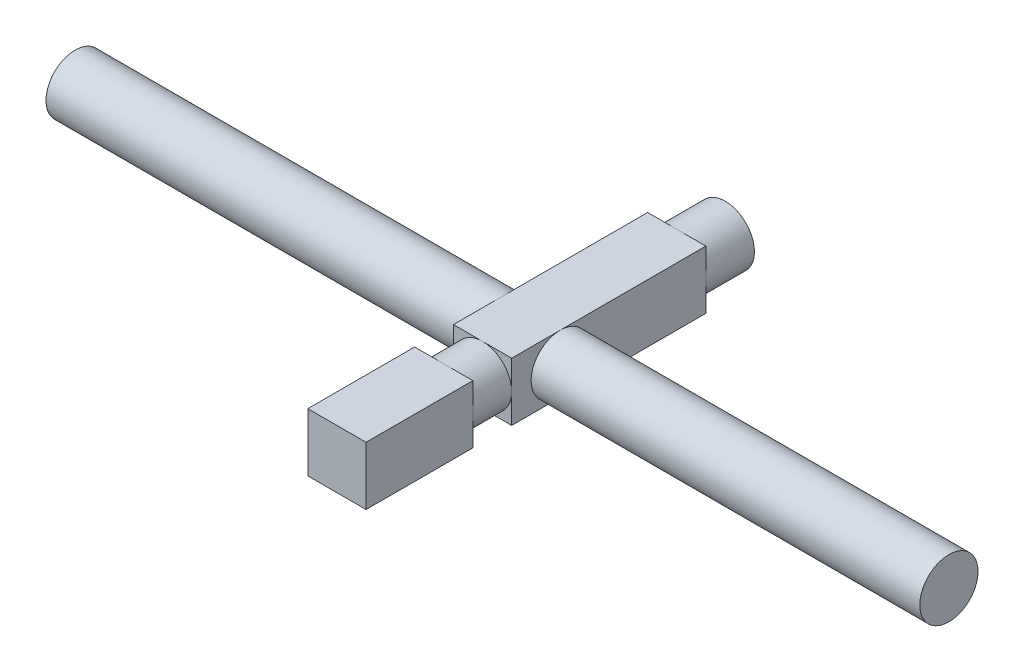
ISO-10303-21;
HEADER;
FILE_DESCRIPTION(('STEP AP214'),'2;1');
FILE_NAME('part.step','',(''),(''),'','','');
FILE_SCHEMA(('AUTOMOTIVE_DESIGN { 1 0 10303 214 1 1 1 1 }'));
ENDSEC;
DATA;
#1=APPLICATION_CONTEXT('core data for automotive mechanical design processes');
#2=APPLICATION_PROTOCOL_DEFINITION('international standard','automotive_design',2000,#1);
#3=PRODUCT_CONTEXT('',#1,'mechanical');
#4=PRODUCT('Part','Part','',(#3));
#5=PRODUCT_RELATED_PRODUCT_CATEGORY('part','',(#4));
#6=PRODUCT_DEFINITION_FORMATION('','',#4);
#7=PRODUCT_DEFINITION_CONTEXT('part definition',#1,'design');
#8=PRODUCT_DEFINITION('design','',#6,#7);
#9=PRODUCT_DEFINITION_SHAPE('','',#8);
#10=(LENGTH_UNIT() NAMED_UNIT(*) SI_UNIT(.MILLI.,.METRE.));
#11=(NAMED_UNIT(*) PLANE_ANGLE_UNIT() SI_UNIT($,.RADIAN.));
#12=(NAMED_UNIT(*) SI_UNIT($,.STERADIAN.) SOLID_ANGLE_UNIT());
#13=UNCERTAINTY_MEASURE_WITH_UNIT(LENGTH_MEASURE(1.E-05),#10,'distance_accuracy_value','');
#14=(GEOMETRIC_REPRESENTATION_CONTEXT(3) GLOBAL_UNCERTAINTY_ASSIGNED_CONTEXT((#13)) GLOBAL_UNIT_ASSIGNED_CONTEXT((#10,
#11,#12)) REPRESENTATION_CONTEXT('',''));
#15=CARTESIAN_POINT('',(0.,0.,0.));
#16=DIRECTION('',(0.,0.,1.));
#17=DIRECTION('',(1.,0.,0.));
#18=AXIS2_PLACEMENT_3D('',#15,#16,#17);
#19=CARTESIAN_POINT('',(-3.,-3.00000000000001,-20.));
#20=DIRECTION('',(0.,-1.,0.));
#21=DIRECTION('',(0.,0.,-1.));
#22=AXIS2_PLACEMENT_3D('',#19,#20,#21);
#23=PLANE('',#22);
#24=DIRECTION('',(0.,0.,-1.));
#25=VECTOR('',#24,1.);
#26=CARTESIAN_POINT('',(3.,-3.00000000000001,-20.));
#27=LINE('',#26,#25);
#28=CARTESIAN_POINT('',(3.,-3.,5.));
#29=VERTEX_POINT('',#28);
#30=CARTESIAN_POINT('',(3.,-3.,0.));
#31=VERTEX_POINT('',#30);
#32=EDGE_CURVE('E284',#29,#31,#27,.T.);
#33=ORIENTED_EDGE('',*,*,#32,.F.);
#34=DIRECTION('',(-1.,0.,0.));
#35=VECTOR('',#34,1.);
#36=CARTESIAN_POINT('',(-3.,-3.,5.));
#37=LINE('',#36,#35);
#38=CARTESIAN_POINT('',(0.,-3.,5.));
#39=VERTEX_POINT('',#38);
#40=EDGE_CURVE('E122',#29,#39,#37,.T.);
#41=ORIENTED_EDGE('',*,*,#40,.T.);
#42=CARTESIAN_POINT('',(-3.,-3.,5.));
#43=VERTEX_POINT('',#42);
#44=EDGE_CURVE('E332',#39,#43,#37,.T.);
#45=ORIENTED_EDGE('',*,*,#44,.T.);
#46=DIRECTION('',(0.,0.,-1.));
#47=VECTOR('',#46,1.);
#48=CARTESIAN_POINT('',(-3.,-3.00000000000001,-20.));
#49=LINE('',#48,#47);
#50=CARTESIAN_POINT('',(-3.,-3.,0.));
#51=VERTEX_POINT('',#50);
#52=EDGE_CURVE('E273',#43,#51,#49,.T.);
#53=ORIENTED_EDGE('',*,*,#52,.T.);
#54=CARTESIAN_POINT('',(-3.,-3.00000000000001,-15.));
#55=VERTEX_POINT('',#54);
#56=EDGE_CURVE('E274',#51,#55,#49,.T.);
#57=ORIENTED_EDGE('',*,*,#56,.T.);
#58=DIRECTION('',(-1.,0.,0.));
#59=VECTOR('',#58,1.);
#60=CARTESIAN_POINT('',(0.,-3.00000000000001,-15.));
#61=LINE('',#60,#59);
#62=CARTESIAN_POINT('',(0.,-3.00000000000001,-15.));
#63=VERTEX_POINT('',#62);
#64=EDGE_CURVE('E316',#63,#55,#61,.T.);
#65=ORIENTED_EDGE('',*,*,#64,.F.);
#66=DIRECTION('',(-1.,0.,0.));
#67=VECTOR('',#66,1.);
#68=CARTESIAN_POINT('',(0.,-3.00000000000001,-15.));
#69=LINE('',#68,#67);
#70=CARTESIAN_POINT('',(3.,-3.00000000000001,-15.));
#71=VERTEX_POINT('',#70);
#72=EDGE_CURVE('E309',#71,#63,#69,.T.);
#73=ORIENTED_EDGE('',*,*,#72,.F.);
#74=EDGE_CURVE('E285',#31,#71,#27,.T.);
#75=ORIENTED_EDGE('',*,*,#74,.F.);
#76=EDGE_LOOP('',(#33,#41,#45,#53,#57,#65,#73,#75));
#77=FACE_BOUND('',#76,.T.);
#78=ADVANCED_FACE('F99',(#77),#23,.T.);
#79=CARTESIAN_POINT('',(-3.,3.00000000000001,-20.));
#80=DIRECTION('',(0.,1.,0.));
#81=DIRECTION('',(0.,0.,1.));
#82=AXIS2_PLACEMENT_3D('',#79,#80,#81);
#83=PLANE('',#82);
#84=DIRECTION('',(0.,0.,1.));
#85=VECTOR('',#84,1.);
#86=CARTESIAN_POINT('',(-3.,3.00000000000001,-20.));
#87=LINE('',#86,#85);
#88=CARTESIAN_POINT('',(-3.,3.,0.));
#89=VERTEX_POINT('',#88);
#90=CARTESIAN_POINT('',(-3.,3.,5.));
#91=VERTEX_POINT('',#90);
#92=EDGE_CURVE('E268',#89,#91,#87,.T.);
#93=ORIENTED_EDGE('',*,*,#92,.T.);
#94=DIRECTION('',(1.,0.,0.));
#95=VECTOR('',#94,1.);
#96=CARTESIAN_POINT('',(-3.,3.,5.));
#97=LINE('',#96,#95);
#98=CARTESIAN_POINT('',(0.,3.,5.));
#99=VERTEX_POINT('',#98);
#100=EDGE_CURVE('E334',#91,#99,#97,.T.);
#101=ORIENTED_EDGE('',*,*,#100,.T.);
#102=CARTESIAN_POINT('',(3.,3.00000000000001,5.));
#103=VERTEX_POINT('',#102);
#104=EDGE_CURVE('E235',#99,#103,#97,.T.);
#105=ORIENTED_EDGE('',*,*,#104,.T.);
#106=DIRECTION('',(0.,0.,1.));
#107=VECTOR('',#106,1.);
#108=CARTESIAN_POINT('',(3.,3.00000000000001,-20.));
#109=LINE('',#108,#107);
#110=CARTESIAN_POINT('',(3.,3.,0.));
#111=VERTEX_POINT('',#110);
#112=EDGE_CURVE('E243',#111,#103,#109,.T.);
#113=ORIENTED_EDGE('',*,*,#112,.F.);
#114=CARTESIAN_POINT('',(3.,3.,-15.));
#115=VERTEX_POINT('',#114);
#116=EDGE_CURVE('E278',#115,#111,#109,.T.);
#117=ORIENTED_EDGE('',*,*,#116,.F.);
#118=DIRECTION('',(1.,0.,0.));
#119=VECTOR('',#118,1.);
#120=CARTESIAN_POINT('',(0.,3.00000000000001,-15.));
#121=LINE('',#120,#119);
#122=CARTESIAN_POINT('',(0.,3.00000000000001,-15.));
#123=VERTEX_POINT('',#122);
#124=EDGE_CURVE('E294',#123,#115,#121,.T.);
#125=ORIENTED_EDGE('',*,*,#124,.F.);
#126=DIRECTION('',(1.,0.,0.));
#127=VECTOR('',#126,1.);
#128=CARTESIAN_POINT('',(0.,3.00000000000001,-15.));
#129=LINE('',#128,#127);
#130=CARTESIAN_POINT('',(-3.,3.00000000000001,-15.));
#131=VERTEX_POINT('',#130);
#132=EDGE_CURVE('E302',#131,#123,#129,.T.);
#133=ORIENTED_EDGE('',*,*,#132,.F.);
#134=EDGE_CURVE('E266',#131,#89,#87,.T.);
#135=ORIENTED_EDGE('',*,*,#134,.T.);
#136=EDGE_LOOP('',(#93,#101,#105,#113,#117,#125,#133,#135));
#137=FACE_BOUND('',#136,.T.);
#138=ADVANCED_FACE('F382',(#137),#83,.T.);
#139=CARTESIAN_POINT('',(-3.,0.,0.));
#140=DIRECTION('',(1.,0.,0.));
#141=DIRECTION('',(0.,0.,-1.));
#142=AXIS2_PLACEMENT_3D('',#139,#140,#141);
#143=PLANE('',#142);
#144=DIRECTION('',(0.,-1.,0.));
#145=VECTOR('',#144,1.);
#146=CARTESIAN_POINT('',(-3.,0.,5.));
#147=LINE('',#146,#145);
#148=CARTESIAN_POINT('',(-3.,0.,5.));
#149=VERTEX_POINT('',#148);
#150=EDGE_CURVE('E330',#91,#149,#147,.T.);
#151=ORIENTED_EDGE('',*,*,#150,.F.);
#152=ORIENTED_EDGE('',*,*,#92,.F.);
#153=CARTESIAN_POINT('',(-3.,0.,0.));
#154=DIRECTION('',(1.,0.,0.));
#155=DIRECTION('',(0.,0.,-1.));
#156=AXIS2_PLACEMENT_3D('',#153,#154,#155);
#157=CIRCLE('',#156,3.00000000000001);
#158=EDGE_CURVE('E221',#89,#51,#157,.T.);
#159=ORIENTED_EDGE('',*,*,#158,.T.);
#160=ORIENTED_EDGE('',*,*,#52,.F.);
#161=EDGE_CURVE('E329',#149,#43,#147,.T.);
#162=ORIENTED_EDGE('',*,*,#161,.F.);
#163=EDGE_LOOP('',(#151,#152,#159,#160,#162));
#164=FACE_BOUND('',#163,.T.);
#165=ADVANCED_FACE('F388',(#164),#143,.F.);
#166=CARTESIAN_POINT('',(3.,0.,0.));
#167=DIRECTION('',(1.,0.,0.));
#168=DIRECTION('',(0.,0.,-1.));
#169=AXIS2_PLACEMENT_3D('',#166,#167,#168);
#170=PLANE('',#169);
#171=ORIENTED_EDGE('',*,*,#112,.T.);
#172=DIRECTION('',(0.,-1.,0.));
#173=VECTOR('',#172,1.);
#174=CARTESIAN_POINT('',(3.,0.,5.));
#175=LINE('',#174,#173);
#176=CARTESIAN_POINT('',(3.,0.,5.));
#177=VERTEX_POINT('',#176);
#178=EDGE_CURVE('E220',#103,#177,#175,.T.);
#179=ORIENTED_EDGE('',*,*,#178,.T.);
#180=EDGE_CURVE('E212',#177,#29,#175,.T.);
#181=ORIENTED_EDGE('',*,*,#180,.T.);
#182=ORIENTED_EDGE('',*,*,#32,.T.);
#183=CARTESIAN_POINT('',(3.,0.,0.));
#184=DIRECTION('',(1.,0.,0.));
#185=DIRECTION('',(0.,0.,-1.));
#186=AXIS2_PLACEMENT_3D('',#183,#184,#185);
#187=CIRCLE('',#186,3.00000000000001);
#188=EDGE_CURVE('E248',#111,#31,#187,.T.);
#189=ORIENTED_EDGE('',*,*,#188,.F.);
#190=EDGE_LOOP('',(#171,#179,#181,#182,#189));
#191=FACE_BOUND('',#190,.T.);
#192=ADVANCED_FACE('F240',(#191),#170,.T.);
#193=CARTESIAN_POINT('',(-3.,-3.00000000000001,-20.));
#194=DIRECTION('',(0.,0.,-1.));
#195=DIRECTION('',(-1.,0.,0.));
#196=AXIS2_PLACEMENT_3D('',#193,#194,#195);
#197=PLANE('',#196);
#198=CARTESIAN_POINT('',(0.,0.,-20.));
#199=DIRECTION('',(0.,0.,-1.));
#200=DIRECTION('',(-1.,0.,0.));
#201=AXIS2_PLACEMENT_3D('',#198,#199,#200);
#202=CIRCLE('',#201,3.00000000000001);
#203=CARTESIAN_POINT('',(-3.00000000000001,0.,-20.));
#204=VERTEX_POINT('',#203);
#205=EDGE_CURVE('E286',#204,#204,#202,.T.);
#206=ORIENTED_EDGE('',*,*,#205,.T.);
#207=EDGE_LOOP('',(#206));
#208=FACE_BOUND('',#207,.T.);
#209=ADVANCED_FACE('F404',(#208),#197,.T.);
#210=DIRECTION('',(0.,1.,0.));
#211=VECTOR('',#210,1.);
#212=CARTESIAN_POINT('',(-3.,0.,-15.));
#213=LINE('',#212,#211);
#214=CARTESIAN_POINT('',(-3.,0.,-15.));
#215=VERTEX_POINT('',#214);
#216=EDGE_CURVE('E313',#55,#215,#213,.T.);
#217=ORIENTED_EDGE('',*,*,#216,.F.);
#218=ORIENTED_EDGE('',*,*,#56,.F.);
#219=EDGE_CURVE('E245',#51,#89,#157,.T.);
#220=ORIENTED_EDGE('',*,*,#219,.T.);
#221=ORIENTED_EDGE('',*,*,#134,.F.);
#222=DIRECTION('',(0.,1.,0.));
#223=VECTOR('',#222,1.);
#224=CARTESIAN_POINT('',(-3.,0.,-15.));
#225=LINE('',#224,#223);
#226=EDGE_CURVE('E300',#215,#131,#225,.T.);
#227=ORIENTED_EDGE('',*,*,#226,.F.);
#228=EDGE_LOOP('',(#217,#218,#220,#221,#227));
#229=FACE_BOUND('',#228,.T.);
#230=ADVANCED_FACE('F401',(#229),#143,.F.);
#231=ORIENTED_EDGE('',*,*,#74,.T.);
#232=DIRECTION('',(0.,-1.,0.));
#233=VECTOR('',#232,1.);
#234=CARTESIAN_POINT('',(3.,0.,-15.));
#235=LINE('',#234,#233);
#236=CARTESIAN_POINT('',(3.,0.,-15.));
#237=VERTEX_POINT('',#236);
#238=EDGE_CURVE('E307',#237,#71,#235,.T.);
#239=ORIENTED_EDGE('',*,*,#238,.F.);
#240=DIRECTION('',(0.,-1.,0.));
#241=VECTOR('',#240,1.);
#242=CARTESIAN_POINT('',(3.,0.,-15.));
#243=LINE('',#242,#241);
#244=EDGE_CURVE('E291',#115,#237,#243,.T.);
#245=ORIENTED_EDGE('',*,*,#244,.F.);
#246=ORIENTED_EDGE('',*,*,#116,.T.);
#247=EDGE_CURVE('E249',#31,#111,#187,.T.);
#248=ORIENTED_EDGE('',*,*,#247,.F.);
#249=EDGE_LOOP('',(#231,#239,#245,#246,#248));
#250=FACE_BOUND('',#249,.T.);
#251=ADVANCED_FACE('F411',(#250),#170,.T.);
#252=CARTESIAN_POINT('',(-46.9660194174757,0.,0.));
#253=DIRECTION('',(-1.,0.,0.));
#254=DIRECTION('',(0.,0.,1.));
#255=AXIS2_PLACEMENT_3D('',#252,#253,#254);
#256=CYLINDRICAL_SURFACE('',#255,3.00000000000001);
#257=CARTESIAN_POINT('',(-46.9660194174757,0.,0.));
#258=DIRECTION('',(-1.,0.,0.));
#259=DIRECTION('',(0.,0.,1.));
#260=AXIS2_PLACEMENT_3D('',#257,#258,#259);
#261=CIRCLE('',#260,3.);
#262=CARTESIAN_POINT('',(-46.9660194174757,0.,3.));
#263=VERTEX_POINT('',#262);
#264=EDGE_CURVE('E255',#263,#263,#261,.T.);
#265=ORIENTED_EDGE('',*,*,#264,.F.);
#266=EDGE_LOOP('',(#265));
#267=FACE_BOUND('',#266,.T.);
#268=ORIENTED_EDGE('',*,*,#158,.F.);
#269=ORIENTED_EDGE('',*,*,#219,.F.);
#270=EDGE_LOOP('',(#268,#269));
#271=FACE_BOUND('',#270,.T.);
#272=ADVANCED_FACE('F442',(#267,#271),#256,.T.);
#273=CARTESIAN_POINT('',(-46.9660194174757,3.,0.));
#274=DIRECTION('',(1.,0.,0.));
#275=DIRECTION('',(0.,0.,-1.));
#276=AXIS2_PLACEMENT_3D('',#273,#274,#275);
#277=PLANE('',#276);
#278=ORIENTED_EDGE('',*,*,#264,.T.);
#279=EDGE_LOOP('',(#278));
#280=FACE_BOUND('',#279,.T.);
#281=ADVANCED_FACE('F101',(#280),#277,.F.);
#282=CARTESIAN_POINT('',(43.0339805825243,0.,0.));
#283=DIRECTION('',(-1.,0.,0.));
#284=DIRECTION('',(0.,0.,1.));
#285=AXIS2_PLACEMENT_3D('',#282,#283,#284);
#286=PLANE('',#285);
#287=CARTESIAN_POINT('',(43.0339805825243,0.,0.));
#288=DIRECTION('',(-1.,0.,0.));
#289=DIRECTION('',(0.,0.,1.));
#290=AXIS2_PLACEMENT_3D('',#287,#288,#289);
#291=CIRCLE('',#290,3.00000000000001);
#292=CARTESIAN_POINT('',(43.0339805825243,0.,3.00000000000001));
#293=VERTEX_POINT('',#292);
#294=EDGE_CURVE('E252',#293,#293,#291,.T.);
#295=ORIENTED_EDGE('',*,*,#294,.F.);
#296=EDGE_LOOP('',(#295));
#297=FACE_BOUND('',#296,.T.);
#298=ADVANCED_FACE('F601',(#297),#286,.F.);
#299=ORIENTED_EDGE('',*,*,#247,.T.);
#300=ORIENTED_EDGE('',*,*,#188,.T.);
#301=EDGE_LOOP('',(#299,#300));
#302=FACE_BOUND('',#301,.T.);
#303=ORIENTED_EDGE('',*,*,#294,.T.);
#304=EDGE_LOOP('',(#303));
#305=FACE_BOUND('',#304,.T.);
#306=ADVANCED_FACE('F420',(#302,#305),#256,.T.);
#307=CARTESIAN_POINT('',(0.,0.,-15.));
#308=DIRECTION('',(0.,0.,-1.));
#309=DIRECTION('',(-1.,0.,0.));
#310=AXIS2_PLACEMENT_3D('',#307,#308,#309);
#311=CYLINDRICAL_SURFACE('',#310,3.00000000000001);
#312=ORIENTED_EDGE('',*,*,#205,.F.);
#313=EDGE_LOOP('',(#312));
#314=FACE_BOUND('',#313,.T.);
#315=CARTESIAN_POINT('',(0.,0.,-15.));
#316=DIRECTION('',(0.,0.,-1.));
#317=DIRECTION('',(-1.,0.,0.));
#318=AXIS2_PLACEMENT_3D('',#315,#316,#317);
#319=CIRCLE('',#318,3.00000000000001);
#320=EDGE_CURVE('E312',#63,#215,#319,.T.);
#321=ORIENTED_EDGE('',*,*,#320,.T.);
#322=CARTESIAN_POINT('',(0.,0.,-15.));
#323=DIRECTION('',(0.,0.,-1.));
#324=DIRECTION('',(-1.,0.,0.));
#325=AXIS2_PLACEMENT_3D('',#322,#323,#324);
#326=CIRCLE('',#325,3.00000000000001);
#327=EDGE_CURVE('E290',#215,#123,#326,.T.);
#328=ORIENTED_EDGE('',*,*,#327,.T.);
#329=CARTESIAN_POINT('',(0.,0.,-15.));
#330=DIRECTION('',(0.,0.,-1.));
#331=DIRECTION('',(-1.,0.,0.));
#332=AXIS2_PLACEMENT_3D('',#329,#330,#331);
#333=CIRCLE('',#332,3.00000000000001);
#334=EDGE_CURVE('E289',#123,#237,#333,.T.);
#335=ORIENTED_EDGE('',*,*,#334,.T.);
#336=CARTESIAN_POINT('',(0.,0.,-15.));
#337=DIRECTION('',(0.,0.,-1.));
#338=DIRECTION('',(-1.,0.,0.));
#339=AXIS2_PLACEMENT_3D('',#336,#337,#338);
#340=CIRCLE('',#339,3.00000000000001);
#341=EDGE_CURVE('E304',#237,#63,#340,.T.);
#342=ORIENTED_EDGE('',*,*,#341,.T.);
#343=EDGE_LOOP('',(#321,#328,#335,#342));
#344=FACE_BOUND('',#343,.T.);
#345=ADVANCED_FACE('F416',(#314,#344),#311,.T.);
#346=CARTESIAN_POINT('',(0.,0.,-15.));
#347=DIRECTION('',(0.,0.,-1.));
#348=DIRECTION('',(-1.,0.,0.));
#349=AXIS2_PLACEMENT_3D('',#346,#347,#348);
#350=PLANE('',#349);
#351=ORIENTED_EDGE('',*,*,#334,.F.);
#352=ORIENTED_EDGE('',*,*,#124,.T.);
#353=ORIENTED_EDGE('',*,*,#244,.T.);
#354=EDGE_LOOP('',(#351,#352,#353));
#355=FACE_BOUND('',#354,.T.);
#356=ADVANCED_FACE('F419',(#355),#350,.T.);
#357=CARTESIAN_POINT('',(0.,0.,-15.));
#358=DIRECTION('',(0.,0.,-1.));
#359=DIRECTION('',(-1.,0.,0.));
#360=AXIS2_PLACEMENT_3D('',#357,#358,#359);
#361=PLANE('',#360);
#362=ORIENTED_EDGE('',*,*,#327,.F.);
#363=ORIENTED_EDGE('',*,*,#226,.T.);
#364=ORIENTED_EDGE('',*,*,#132,.T.);
#365=EDGE_LOOP('',(#362,#363,#364));
#366=FACE_BOUND('',#365,.T.);
#367=ADVANCED_FACE('F432',(#366),#361,.T.);
#368=CARTESIAN_POINT('',(0.,0.,-15.));
#369=DIRECTION('',(0.,0.,-1.));
#370=DIRECTION('',(-1.,0.,0.));
#371=AXIS2_PLACEMENT_3D('',#368,#369,#370);
#372=PLANE('',#371);
#373=ORIENTED_EDGE('',*,*,#341,.F.);
#374=ORIENTED_EDGE('',*,*,#238,.T.);
#375=ORIENTED_EDGE('',*,*,#72,.T.);
#376=EDGE_LOOP('',(#373,#374,#375));
#377=FACE_BOUND('',#376,.T.);
#378=ADVANCED_FACE('F461',(#377),#372,.T.);
#379=CARTESIAN_POINT('',(0.,0.,-15.));
#380=DIRECTION('',(0.,0.,-1.));
#381=DIRECTION('',(-1.,0.,0.));
#382=AXIS2_PLACEMENT_3D('',#379,#380,#381);
#383=PLANE('',#382);
#384=ORIENTED_EDGE('',*,*,#320,.F.);
#385=ORIENTED_EDGE('',*,*,#64,.T.);
#386=ORIENTED_EDGE('',*,*,#216,.T.);
#387=EDGE_LOOP('',(#384,#385,#386));
#388=FACE_BOUND('',#387,.T.);
#389=ADVANCED_FACE('F427',(#388),#383,.T.);
#390=CARTESIAN_POINT('',(-1.96601941747573,0.,9.));
#391=DIRECTION('',(0.,0.,1.));
#392=DIRECTION('',(1.,0.,0.));
#393=AXIS2_PLACEMENT_3D('',#390,#391,#392);
#394=PLANE('',#393);
#395=CARTESIAN_POINT('',(0.,0.,9.));
#396=DIRECTION('',(0.,0.,1.));
#397=DIRECTION('',(1.,0.,0.));
#398=AXIS2_PLACEMENT_3D('',#395,#396,#397);
#399=CIRCLE('',#398,3.);
#400=CARTESIAN_POINT('',(-3.,0.,9.));
#401=VERTEX_POINT('',#400);
#402=CARTESIAN_POINT('',(0.,-3.,9.));
#403=VERTEX_POINT('',#402);
#404=EDGE_CURVE('E340',#401,#403,#399,.T.);
#405=ORIENTED_EDGE('',*,*,#404,.T.);
#406=DIRECTION('',(-1.,0.,0.));
#407=VECTOR('',#406,1.);
#408=CARTESIAN_POINT('',(-3.,-3.,9.));
#409=LINE('',#408,#407);
#410=CARTESIAN_POINT('',(-3.,-3.,9.));
#411=VERTEX_POINT('',#410);
#412=EDGE_CURVE('E323',#403,#411,#409,.T.);
#413=ORIENTED_EDGE('',*,*,#412,.T.);
#414=DIRECTION('',(0.,-1.,0.));
#415=VECTOR('',#414,1.);
#416=CARTESIAN_POINT('',(-3.,0.,9.));
#417=LINE('',#416,#415);
#418=EDGE_CURVE('E317',#401,#411,#417,.T.);
#419=ORIENTED_EDGE('',*,*,#418,.F.);
#420=EDGE_LOOP('',(#405,#413,#419));
#421=FACE_BOUND('',#420,.T.);
#422=ADVANCED_FACE('F346',(#421),#394,.F.);
#423=DIRECTION('',(1.,0.,0.));
#424=VECTOR('',#423,1.);
#425=CARTESIAN_POINT('',(-3.,3.,9.));
#426=LINE('',#425,#424);
#427=CARTESIAN_POINT('',(-3.,3.,9.));
#428=VERTEX_POINT('',#427);
#429=CARTESIAN_POINT('',(0.,3.,9.));
#430=VERTEX_POINT('',#429);
#431=EDGE_CURVE('E326',#428,#430,#426,.T.);
#432=ORIENTED_EDGE('',*,*,#431,.T.);
#433=EDGE_CURVE('E336',#430,#401,#399,.T.);
#434=ORIENTED_EDGE('',*,*,#433,.T.);
#435=EDGE_CURVE('E320',#428,#401,#417,.T.);
#436=ORIENTED_EDGE('',*,*,#435,.F.);
#437=EDGE_LOOP('',(#432,#434,#436));
#438=FACE_BOUND('',#437,.T.);
#439=ADVANCED_FACE('F359',(#438),#394,.F.);
#440=CARTESIAN_POINT('',(3.,-3.00000000000001,9.));
#441=VERTEX_POINT('',#440);
#442=EDGE_CURVE('E324',#441,#403,#409,.T.);
#443=ORIENTED_EDGE('',*,*,#442,.T.);
#444=CARTESIAN_POINT('',(3.,0.,9.));
#445=VERTEX_POINT('',#444);
#446=EDGE_CURVE('E237',#403,#445,#399,.T.);
#447=ORIENTED_EDGE('',*,*,#446,.T.);
#448=DIRECTION('',(0.,-1.,0.));
#449=VECTOR('',#448,1.);
#450=CARTESIAN_POINT('',(3.,0.,9.));
#451=LINE('',#450,#449);
#452=EDGE_CURVE('E103',#445,#441,#451,.T.);
#453=ORIENTED_EDGE('',*,*,#452,.T.);
#454=EDGE_LOOP('',(#443,#447,#453));
#455=FACE_BOUND('',#454,.T.);
#456=ADVANCED_FACE('F369',(#455),#394,.F.);
#457=CARTESIAN_POINT('',(0.,0.,9.));
#458=DIRECTION('',(0.,0.,-1.));
#459=DIRECTION('',(-1.,0.,0.));
#460=AXIS2_PLACEMENT_3D('',#457,#458,#459);
#461=CYLINDRICAL_SURFACE('',#460,3.);
#462=ORIENTED_EDGE('',*,*,#446,.F.);
#463=ORIENTED_EDGE('',*,*,#404,.F.);
#464=ORIENTED_EDGE('',*,*,#433,.F.);
#465=EDGE_CURVE('E114',#445,#430,#399,.T.);
#466=ORIENTED_EDGE('',*,*,#465,.F.);
#467=EDGE_LOOP('',(#462,#463,#464,#466));
#468=FACE_BOUND('',#467,.T.);
#469=CARTESIAN_POINT('',(0.,0.,5.));
#470=DIRECTION('',(0.,0.,1.));
#471=DIRECTION('',(1.,0.,0.));
#472=AXIS2_PLACEMENT_3D('',#469,#470,#471);
#473=CIRCLE('',#472,3.);
#474=EDGE_CURVE('E215',#39,#177,#473,.T.);
#475=ORIENTED_EDGE('',*,*,#474,.T.);
#476=EDGE_CURVE('E227',#177,#99,#473,.T.);
#477=ORIENTED_EDGE('',*,*,#476,.T.);
#478=EDGE_CURVE('E238',#99,#149,#473,.T.);
#479=ORIENTED_EDGE('',*,*,#478,.T.);
#480=EDGE_CURVE('E230',#149,#39,#473,.T.);
#481=ORIENTED_EDGE('',*,*,#480,.T.);
#482=EDGE_LOOP('',(#475,#477,#479,#481));
#483=FACE_BOUND('',#482,.T.);
#484=ADVANCED_FACE('F225',(#468,#483),#461,.T.);
#485=CARTESIAN_POINT('',(-1.96601941747573,0.,5.));
#486=DIRECTION('',(0.,0.,1.));
#487=DIRECTION('',(1.,0.,0.));
#488=AXIS2_PLACEMENT_3D('',#485,#486,#487);
#489=PLANE('',#488);
#490=ORIENTED_EDGE('',*,*,#161,.T.);
#491=ORIENTED_EDGE('',*,*,#44,.F.);
#492=ORIENTED_EDGE('',*,*,#480,.F.);
#493=EDGE_LOOP('',(#490,#491,#492));
#494=FACE_BOUND('',#493,.T.);
#495=ADVANCED_FACE('F371',(#494),#489,.T.);
#496=ORIENTED_EDGE('',*,*,#150,.T.);
#497=ORIENTED_EDGE('',*,*,#478,.F.);
#498=ORIENTED_EDGE('',*,*,#100,.F.);
#499=EDGE_LOOP('',(#496,#497,#498));
#500=FACE_BOUND('',#499,.T.);
#501=ADVANCED_FACE('F377',(#500),#489,.T.);
#502=ORIENTED_EDGE('',*,*,#180,.F.);
#503=ORIENTED_EDGE('',*,*,#474,.F.);
#504=ORIENTED_EDGE('',*,*,#40,.F.);
#505=EDGE_LOOP('',(#502,#503,#504));
#506=FACE_BOUND('',#505,.T.);
#507=ADVANCED_FACE('F214',(#506),#489,.T.);
#508=CARTESIAN_POINT('',(3.,3.00000000000001,9.));
#509=VERTEX_POINT('',#508);
#510=EDGE_CURVE('E327',#430,#509,#426,.T.);
#511=ORIENTED_EDGE('',*,*,#510,.T.);
#512=EDGE_CURVE('E13',#509,#445,#451,.T.);
#513=ORIENTED_EDGE('',*,*,#512,.T.);
#514=ORIENTED_EDGE('',*,*,#465,.T.);
#515=EDGE_LOOP('',(#511,#513,#514));
#516=FACE_BOUND('',#515,.T.);
#517=ADVANCED_FACE('F365',(#516),#394,.F.);
#518=ORIENTED_EDGE('',*,*,#476,.F.);
#519=ORIENTED_EDGE('',*,*,#178,.F.);
#520=ORIENTED_EDGE('',*,*,#104,.F.);
#521=EDGE_LOOP('',(#518,#519,#520));
#522=FACE_BOUND('',#521,.T.);
#523=ADVANCED_FACE('F233',(#522),#489,.T.);
#524=CARTESIAN_POINT('',(-3.,3.,20.));
#525=DIRECTION('',(0.,0.,1.));
#526=DIRECTION('',(1.,0.,0.));
#527=AXIS2_PLACEMENT_3D('',#524,#525,#526);
#528=PLANE('',#527);
#529=DIRECTION('',(1.,0.,0.));
#530=VECTOR('',#529,1.);
#531=CARTESIAN_POINT('',(-3.,-3.,20.));
#532=LINE('',#531,#530);
#533=CARTESIAN_POINT('',(-3.,-3.,20.));
#534=VERTEX_POINT('',#533);
#535=CARTESIAN_POINT('',(3.,-3.,20.));
#536=VERTEX_POINT('',#535);
#537=EDGE_CURVE('E258',#534,#536,#532,.T.);
#538=ORIENTED_EDGE('',*,*,#537,.T.);
#539=DIRECTION('',(0.,-1.,0.));
#540=VECTOR('',#539,1.);
#541=CARTESIAN_POINT('',(3.,3.,20.));
#542=LINE('',#541,#540);
#543=CARTESIAN_POINT('',(3.,3.,20.));
#544=VERTEX_POINT('',#543);
#545=EDGE_CURVE('E275',#544,#536,#542,.T.);
#546=ORIENTED_EDGE('',*,*,#545,.F.);
#547=DIRECTION('',(1.,0.,0.));
#548=VECTOR('',#547,1.);
#549=CARTESIAN_POINT('',(-3.,3.,20.));
#550=LINE('',#549,#548);
#551=CARTESIAN_POINT('',(-3.,3.,20.));
#552=VERTEX_POINT('',#551);
#553=EDGE_CURVE('E259',#552,#544,#550,.T.);
#554=ORIENTED_EDGE('',*,*,#553,.F.);
#555=DIRECTION('',(0.,-1.,0.));
#556=VECTOR('',#555,1.);
#557=CARTESIAN_POINT('',(-3.,3.,20.));
#558=LINE('',#557,#556);
#559=EDGE_CURVE('E262',#552,#534,#558,.T.);
#560=ORIENTED_EDGE('',*,*,#559,.T.);
#561=EDGE_LOOP('',(#538,#546,#554,#560));
#562=FACE_BOUND('',#561,.T.);
#563=ADVANCED_FACE('F403',(#562),#528,.T.);
#564=ORIENTED_EDGE('',*,*,#512,.F.);
#565=EDGE_CURVE('E280',#509,#544,#109,.T.);
#566=ORIENTED_EDGE('',*,*,#565,.T.);
#567=ORIENTED_EDGE('',*,*,#545,.T.);
#568=EDGE_CURVE('E281',#536,#441,#27,.T.);
#569=ORIENTED_EDGE('',*,*,#568,.T.);
#570=ORIENTED_EDGE('',*,*,#452,.F.);
#571=EDGE_LOOP('',(#564,#566,#567,#569,#570));
#572=FACE_BOUND('',#571,.T.);
#573=ADVANCED_FACE('F368',(#572),#170,.T.);
#574=EDGE_CURVE('E269',#428,#552,#87,.T.);
#575=ORIENTED_EDGE('',*,*,#574,.F.);
#576=ORIENTED_EDGE('',*,*,#435,.T.);
#577=ORIENTED_EDGE('',*,*,#418,.T.);
#578=EDGE_CURVE('E270',#534,#411,#49,.T.);
#579=ORIENTED_EDGE('',*,*,#578,.F.);
#580=ORIENTED_EDGE('',*,*,#559,.F.);
#581=EDGE_LOOP('',(#575,#576,#577,#579,#580));
#582=FACE_BOUND('',#581,.T.);
#583=ADVANCED_FACE('F355',(#582),#143,.F.);
#584=ORIENTED_EDGE('',*,*,#431,.F.);
#585=ORIENTED_EDGE('',*,*,#574,.T.);
#586=ORIENTED_EDGE('',*,*,#553,.T.);
#587=ORIENTED_EDGE('',*,*,#565,.F.);
#588=ORIENTED_EDGE('',*,*,#510,.F.);
#589=EDGE_LOOP('',(#584,#585,#586,#587,#588));
#590=FACE_BOUND('',#589,.T.);
#591=ADVANCED_FACE('F361',(#590),#83,.T.);
#592=ORIENTED_EDGE('',*,*,#442,.F.);
#593=ORIENTED_EDGE('',*,*,#568,.F.);
#594=ORIENTED_EDGE('',*,*,#537,.F.);
#595=ORIENTED_EDGE('',*,*,#578,.T.);
#596=ORIENTED_EDGE('',*,*,#412,.F.);
#597=EDGE_LOOP('',(#592,#593,#594,#595,#596));
#598=FACE_BOUND('',#597,.T.);
#599=ADVANCED_FACE('F350',(#598),#23,.T.);
#600=CLOSED_SHELL('',(#78,#138,#165,#192,#209,#230,#251,#272,#281,#298,#306,#345,#356,#367,#378,
#389,#422,#439,#456,#484,#495,#501,#507,#517,#523,#563,#573,#583,#591,#599));
#601=MANIFOLD_SOLID_BREP('B2',#600);
#602=ADVANCED_BREP_SHAPE_REPRESENTATION('',(#18,#601),#14);
#603=SHAPE_DEFINITION_REPRESENTATION(#9,#602);
ENDSEC;
END-ISO-10303-21;
